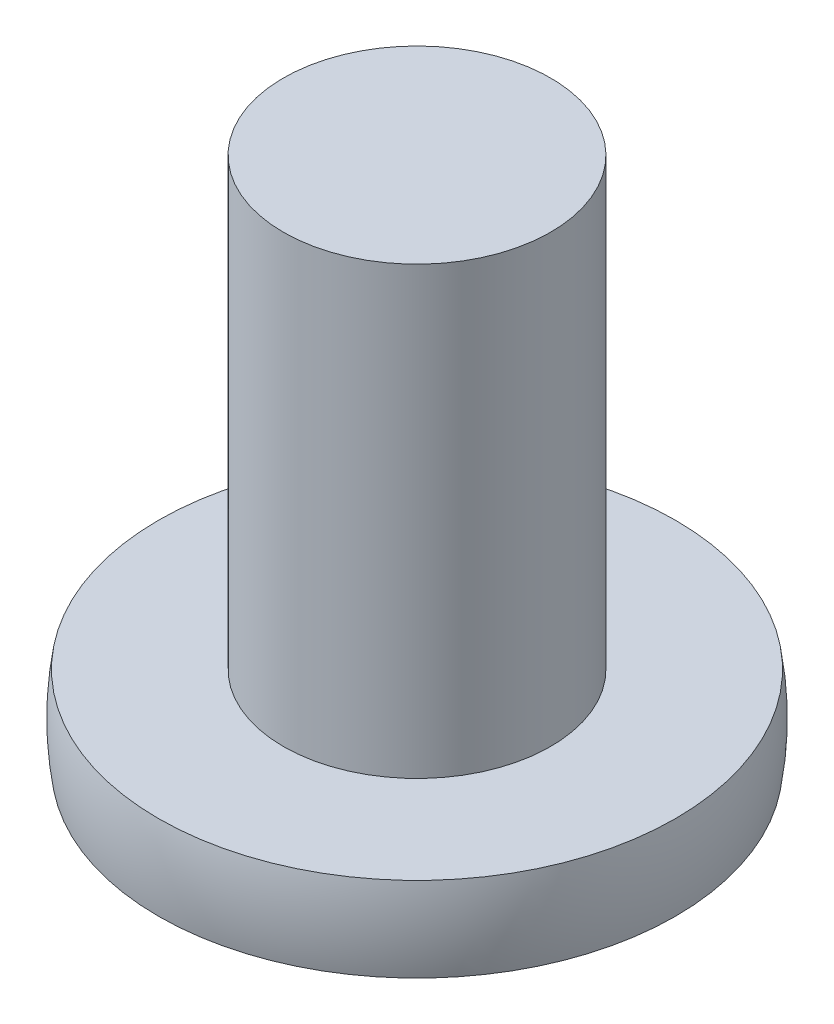
ISO-10303-21;
HEADER;
FILE_DESCRIPTION(('STEP AP214'),'2;1');
FILE_NAME('part.step','',(''),(''),'','','');
FILE_SCHEMA(('AUTOMOTIVE_DESIGN { 1 0 10303 214 1 1 1 1 }'));
ENDSEC;
DATA;
#1=APPLICATION_CONTEXT('core data for automotive mechanical design processes');
#2=APPLICATION_PROTOCOL_DEFINITION('international standard','automotive_design',2000,#1);
#3=PRODUCT_CONTEXT('',#1,'mechanical');
#4=PRODUCT('Part','Part','',(#3));
#5=PRODUCT_RELATED_PRODUCT_CATEGORY('part','',(#4));
#6=PRODUCT_DEFINITION_FORMATION('','',#4);
#7=PRODUCT_DEFINITION_CONTEXT('part definition',#1,'design');
#8=PRODUCT_DEFINITION('design','',#6,#7);
#9=PRODUCT_DEFINITION_SHAPE('','',#8);
#10=(LENGTH_UNIT() NAMED_UNIT(*) SI_UNIT(.MILLI.,.METRE.));
#11=(NAMED_UNIT(*) PLANE_ANGLE_UNIT() SI_UNIT($,.RADIAN.));
#12=(NAMED_UNIT(*) SI_UNIT($,.STERADIAN.) SOLID_ANGLE_UNIT());
#13=UNCERTAINTY_MEASURE_WITH_UNIT(LENGTH_MEASURE(1.E-05),#10,'distance_accuracy_value','');
#14=(GEOMETRIC_REPRESENTATION_CONTEXT(3) GLOBAL_UNCERTAINTY_ASSIGNED_CONTEXT((#13)) GLOBAL_UNIT_ASSIGNED_CONTEXT((#10,
#11,#12)) REPRESENTATION_CONTEXT('',''));
#15=CARTESIAN_POINT('',(0.,0.,0.));
#16=DIRECTION('',(0.,0.,1.));
#17=DIRECTION('',(1.,0.,0.));
#18=AXIS2_PLACEMENT_3D('',#15,#16,#17);
#19=CARTESIAN_POINT('',(-0.588897274573418,0.05,1.02));
#20=DIRECTION('',(-0.866025403784438,0.,0.5));
#21=DIRECTION('',(0.5,0.,0.866025403784439));
#22=AXIS2_PLACEMENT_3D('',#19,#20,#21);
#23=PLANE('',#22);
#24=DIRECTION('',(-0.5,0.,-0.866025403784439));
#25=VECTOR('',#24,1.);
#26=CARTESIAN_POINT('',(-0.588897274573418,0.,1.02));
#27=LINE('',#26,#25);
#28=CARTESIAN_POINT('',(-0.588897274573418,0.,1.02));
#29=VERTEX_POINT('',#28);
#30=CARTESIAN_POINT('',(-1.17779454914684,0.,0.));
#31=VERTEX_POINT('',#30);
#32=EDGE_CURVE('E47',#29,#31,#27,.T.);
#33=ORIENTED_EDGE('',*,*,#32,.F.);
#34=DIRECTION('',(0.,-1.,0.));
#35=VECTOR('',#34,1.);
#36=CARTESIAN_POINT('',(-0.588897274573418,0.05,1.02));
#37=LINE('',#36,#35);
#38=CARTESIAN_POINT('',(-0.588897274573418,-0.95,1.02));
#39=VERTEX_POINT('',#38);
#40=EDGE_CURVE('E127',#29,#39,#37,.T.);
#41=ORIENTED_EDGE('',*,*,#40,.T.);
#42=DIRECTION('',(-0.5,0.,-0.866025403784439));
#43=VECTOR('',#42,1.);
#44=CARTESIAN_POINT('',(-0.588897274573418,-0.95,1.02));
#45=LINE('',#44,#43);
#46=CARTESIAN_POINT('',(-1.17779454914684,-0.95,0.));
#47=VERTEX_POINT('',#46);
#48=EDGE_CURVE('E107',#39,#47,#45,.T.);
#49=ORIENTED_EDGE('',*,*,#48,.T.);
#50=DIRECTION('',(0.,-1.,0.));
#51=VECTOR('',#50,1.);
#52=CARTESIAN_POINT('',(-1.17779454914684,0.05,0.));
#53=LINE('',#52,#51);
#54=EDGE_CURVE('E94',#31,#47,#53,.T.);
#55=ORIENTED_EDGE('',*,*,#54,.F.);
#56=EDGE_LOOP('',(#33,#41,#49,#55));
#57=FACE_BOUND('',#56,.T.);
#58=ADVANCED_FACE('F32',(#57),#23,.F.);
#59=CARTESIAN_POINT('',(0.588897274573419,0.05,1.02));
#60=DIRECTION('',(0.,0.,1.));
#61=DIRECTION('',(1.,0.,0.));
#62=AXIS2_PLACEMENT_3D('',#59,#60,#61);
#63=PLANE('',#62);
#64=DIRECTION('',(-1.,0.,0.));
#65=VECTOR('',#64,1.);
#66=CARTESIAN_POINT('',(0.588897274573419,0.,1.02));
#67=LINE('',#66,#65);
#68=CARTESIAN_POINT('',(0.588897274573419,0.,1.02));
#69=VERTEX_POINT('',#68);
#70=EDGE_CURVE('E54',#69,#29,#67,.T.);
#71=ORIENTED_EDGE('',*,*,#70,.F.);
#72=DIRECTION('',(0.,-1.,0.));
#73=VECTOR('',#72,1.);
#74=CARTESIAN_POINT('',(0.588897274573419,0.05,1.02));
#75=LINE('',#74,#73);
#76=CARTESIAN_POINT('',(0.588897274573419,-0.95,1.02));
#77=VERTEX_POINT('',#76);
#78=EDGE_CURVE('E130',#69,#77,#75,.T.);
#79=ORIENTED_EDGE('',*,*,#78,.T.);
#80=DIRECTION('',(-1.,0.,0.));
#81=VECTOR('',#80,1.);
#82=CARTESIAN_POINT('',(0.588897274573419,-0.95,1.02));
#83=LINE('',#82,#81);
#84=EDGE_CURVE('E124',#77,#39,#83,.T.);
#85=ORIENTED_EDGE('',*,*,#84,.T.);
#86=ORIENTED_EDGE('',*,*,#40,.F.);
#87=EDGE_LOOP('',(#71,#79,#85,#86));
#88=FACE_BOUND('',#87,.T.);
#89=ADVANCED_FACE('F158',(#88),#63,.F.);
#90=CARTESIAN_POINT('',(1.17779454914684,0.05,0.));
#91=DIRECTION('',(0.866025403784439,0.,0.5));
#92=DIRECTION('',(0.5,0.,-0.866025403784439));
#93=AXIS2_PLACEMENT_3D('',#90,#91,#92);
#94=PLANE('',#93);
#95=DIRECTION('',(-0.5,0.,0.866025403784439));
#96=VECTOR('',#95,1.);
#97=CARTESIAN_POINT('',(1.17779454914684,0.,0.));
#98=LINE('',#97,#96);
#99=CARTESIAN_POINT('',(1.17779454914684,0.,0.));
#100=VERTEX_POINT('',#99);
#101=EDGE_CURVE('E111',#100,#69,#98,.T.);
#102=ORIENTED_EDGE('',*,*,#101,.F.);
#103=DIRECTION('',(0.,-1.,0.));
#104=VECTOR('',#103,1.);
#105=CARTESIAN_POINT('',(1.17779454914684,0.05,0.));
#106=LINE('',#105,#104);
#107=CARTESIAN_POINT('',(1.17779454914684,-0.95,0.));
#108=VERTEX_POINT('',#107);
#109=EDGE_CURVE('E132',#100,#108,#106,.T.);
#110=ORIENTED_EDGE('',*,*,#109,.T.);
#111=DIRECTION('',(-0.5,0.,0.866025403784439));
#112=VECTOR('',#111,1.);
#113=CARTESIAN_POINT('',(1.17779454914684,-0.95,0.));
#114=LINE('',#113,#112);
#115=EDGE_CURVE('E121',#108,#77,#114,.T.);
#116=ORIENTED_EDGE('',*,*,#115,.T.);
#117=ORIENTED_EDGE('',*,*,#78,.F.);
#118=EDGE_LOOP('',(#102,#110,#116,#117));
#119=FACE_BOUND('',#118,.T.);
#120=ADVANCED_FACE('F163',(#119),#94,.F.);
#121=CARTESIAN_POINT('',(0.588897274573418,0.05,-1.02));
#122=DIRECTION('',(0.866025403784439,0.,-0.5));
#123=DIRECTION('',(-0.5,0.,-0.866025403784439));
#124=AXIS2_PLACEMENT_3D('',#121,#122,#123);
#125=PLANE('',#124);
#126=DIRECTION('',(0.5,0.,0.866025403784439));
#127=VECTOR('',#126,1.);
#128=CARTESIAN_POINT('',(0.588897274573418,0.,-1.02));
#129=LINE('',#128,#127);
#130=CARTESIAN_POINT('',(0.588897274573418,0.,-1.02));
#131=VERTEX_POINT('',#130);
#132=EDGE_CURVE('E102',#131,#100,#129,.T.);
#133=ORIENTED_EDGE('',*,*,#132,.F.);
#134=DIRECTION('',(0.,-1.,0.));
#135=VECTOR('',#134,1.);
#136=CARTESIAN_POINT('',(0.588897274573418,0.05,-1.02));
#137=LINE('',#136,#135);
#138=CARTESIAN_POINT('',(0.588897274573418,-0.95,-1.02));
#139=VERTEX_POINT('',#138);
#140=EDGE_CURVE('E93',#131,#139,#137,.T.);
#141=ORIENTED_EDGE('',*,*,#140,.T.);
#142=DIRECTION('',(0.5,0.,0.866025403784439));
#143=VECTOR('',#142,1.);
#144=CARTESIAN_POINT('',(0.588897274573418,-0.95,-1.02));
#145=LINE('',#144,#143);
#146=EDGE_CURVE('E118',#139,#108,#145,.T.);
#147=ORIENTED_EDGE('',*,*,#146,.T.);
#148=ORIENTED_EDGE('',*,*,#109,.F.);
#149=EDGE_LOOP('',(#133,#141,#147,#148));
#150=FACE_BOUND('',#149,.T.);
#151=ADVANCED_FACE('F183',(#150),#125,.F.);
#152=CARTESIAN_POINT('',(-0.588897274573419,0.05,-1.02));
#153=DIRECTION('',(0.,0.,-1.));
#154=DIRECTION('',(-1.,0.,0.));
#155=AXIS2_PLACEMENT_3D('',#152,#153,#154);
#156=PLANE('',#155);
#157=DIRECTION('',(1.,0.,0.));
#158=VECTOR('',#157,1.);
#159=CARTESIAN_POINT('',(-0.588897274573419,0.,-1.02));
#160=LINE('',#159,#158);
#161=CARTESIAN_POINT('',(-0.588897274573419,0.,-1.02));
#162=VERTEX_POINT('',#161);
#163=EDGE_CURVE('E98',#162,#131,#160,.T.);
#164=ORIENTED_EDGE('',*,*,#163,.F.);
#165=DIRECTION('',(0.,-1.,0.));
#166=VECTOR('',#165,1.);
#167=CARTESIAN_POINT('',(-0.588897274573419,0.05,-1.02));
#168=LINE('',#167,#166);
#169=CARTESIAN_POINT('',(-0.588897274573419,-0.95,-1.02));
#170=VERTEX_POINT('',#169);
#171=EDGE_CURVE('E85',#162,#170,#168,.T.);
#172=ORIENTED_EDGE('',*,*,#171,.T.);
#173=DIRECTION('',(1.,0.,0.));
#174=VECTOR('',#173,1.);
#175=CARTESIAN_POINT('',(-0.588897274573419,-0.95,-1.02));
#176=LINE('',#175,#174);
#177=EDGE_CURVE('E116',#170,#139,#176,.T.);
#178=ORIENTED_EDGE('',*,*,#177,.T.);
#179=ORIENTED_EDGE('',*,*,#140,.F.);
#180=EDGE_LOOP('',(#164,#172,#178,#179));
#181=FACE_BOUND('',#180,.T.);
#182=ADVANCED_FACE('F99',(#181),#156,.F.);
#183=CARTESIAN_POINT('',(-1.17779454914684,0.05,0.));
#184=DIRECTION('',(-0.866025403784439,0.,-0.5));
#185=DIRECTION('',(-0.5,0.,0.866025403784439));
#186=AXIS2_PLACEMENT_3D('',#183,#184,#185);
#187=PLANE('',#186);
#188=DIRECTION('',(0.5,0.,-0.866025403784439));
#189=VECTOR('',#188,1.);
#190=CARTESIAN_POINT('',(-1.17779454914684,0.,0.));
#191=LINE('',#190,#189);
#192=EDGE_CURVE('E11',#31,#162,#191,.T.);
#193=ORIENTED_EDGE('',*,*,#192,.F.);
#194=ORIENTED_EDGE('',*,*,#54,.T.);
#195=DIRECTION('',(0.5,0.,-0.866025403784439));
#196=VECTOR('',#195,1.);
#197=CARTESIAN_POINT('',(-1.17779454914684,-0.95,0.));
#198=LINE('',#197,#196);
#199=EDGE_CURVE('E89',#47,#170,#198,.T.);
#200=ORIENTED_EDGE('',*,*,#199,.T.);
#201=ORIENTED_EDGE('',*,*,#171,.F.);
#202=EDGE_LOOP('',(#193,#194,#200,#201));
#203=FACE_BOUND('',#202,.T.);
#204=ADVANCED_FACE('F87',(#203),#187,.F.);
#205=CARTESIAN_POINT('',(0.,2.,0.));
#206=DIRECTION('',(0.,-1.,0.));
#207=DIRECTION('',(0.,0.,-1.));
#208=AXIS2_PLACEMENT_3D('',#205,#206,#207);
#209=CYLINDRICAL_SURFACE('',#208,1.5);
#210=CARTESIAN_POINT('',(0.,0.,0.));
#211=DIRECTION('',(0.,1.,0.));
#212=DIRECTION('',(0.,0.,1.));
#213=AXIS2_PLACEMENT_3D('',#210,#211,#212);
#214=CIRCLE('',#213,1.5);
#215=CARTESIAN_POINT('',(0.,0.,1.5));
#216=VERTEX_POINT('',#215);
#217=EDGE_CURVE('E40',#216,#216,#214,.T.);
#218=ORIENTED_EDGE('',*,*,#217,.T.);
#219=EDGE_LOOP('',(#218));
#220=FACE_BOUND('',#219,.T.);
#221=CARTESIAN_POINT('',(0.,5.,0.));
#222=DIRECTION('',(0.,1.,0.));
#223=DIRECTION('',(0.,0.,1.));
#224=AXIS2_PLACEMENT_3D('',#221,#222,#223);
#225=CIRCLE('',#224,1.5);
#226=CARTESIAN_POINT('',(0.,5.,1.5));
#227=VERTEX_POINT('',#226);
#228=EDGE_CURVE('E103',#227,#227,#225,.T.);
#229=ORIENTED_EDGE('',*,*,#228,.F.);
#230=EDGE_LOOP('',(#229));
#231=FACE_BOUND('',#230,.T.);
#232=ADVANCED_FACE('F34',(#220,#231),#209,.T.);
#233=CARTESIAN_POINT('',(0.,0.,0.));
#234=DIRECTION('',(0.,1.,0.));
#235=DIRECTION('',(0.,0.,1.));
#236=AXIS2_PLACEMENT_3D('',#233,#234,#235);
#237=PLANE('',#236);
#238=CARTESIAN_POINT('',(0.,0.,0.));
#239=DIRECTION('',(0.,1.,0.));
#240=DIRECTION('',(0.,0.,1.));
#241=AXIS2_PLACEMENT_3D('',#238,#239,#240);
#242=CIRCLE('',#241,2.90137467418464);
#243=CARTESIAN_POINT('',(0.,0.,2.90137467418464));
#244=VERTEX_POINT('',#243);
#245=EDGE_CURVE('E138',#244,#244,#242,.T.);
#246=ORIENTED_EDGE('',*,*,#245,.T.);
#247=EDGE_LOOP('',(#246));
#248=FACE_BOUND('',#247,.T.);
#249=ORIENTED_EDGE('',*,*,#217,.F.);
#250=EDGE_LOOP('',(#249));
#251=FACE_BOUND('',#250,.T.);
#252=ADVANCED_FACE('F145',(#248,#251),#237,.T.);
#253=CARTESIAN_POINT('',(0.,-0.475,0.));
#254=DIRECTION('',(0.,1.,0.));
#255=DIRECTION('',(0.,0.,1.));
#256=AXIS2_PLACEMENT_3D('',#253,#254,#255);
#257=SPHERICAL_SURFACE('',#256,2.94);
#258=CARTESIAN_POINT('',(0.,-0.95,0.));
#259=DIRECTION('',(0.,1.,0.));
#260=DIRECTION('',(0.,0.,1.));
#261=AXIS2_PLACEMENT_3D('',#258,#259,#260);
#262=CIRCLE('',#261,2.90137467418464);
#263=CARTESIAN_POINT('',(0.,-0.95,2.90137467418464));
#264=VERTEX_POINT('',#263);
#265=EDGE_CURVE('E129',#264,#264,#262,.T.);
#266=CARTESIAN_POINT('',(0.,0.,2.90137467418464));
#267=CARTESIAN_POINT('',(0.,-0.00980881629928072,2.90298053131762));
#268=CARTESIAN_POINT('',(0.,-0.0196257766451737,2.90453664313114));
#269=CARTESIAN_POINT('',(0.,-0.0392749743767388,2.90754922413465));
#270=CARTESIAN_POINT('',(0.,-0.0491072117624109,2.90900569332463));
#271=CARTESIAN_POINT('',(0.,-0.0687859525200891,2.91181883709648));
#272=CARTESIAN_POINT('',(0.,-0.078632455892095,2.91317551167835));
#273=CARTESIAN_POINT('',(0.,-0.0983387156804639,2.91578892726105));
#274=CARTESIAN_POINT('',(0.,-0.108198472096827,2.91704566826189));
#275=CARTESIAN_POINT('',(0.,-0.127930223781495,2.91945908725332));
#276=CARTESIAN_POINT('',(0.,-0.137802219049799,2.92061576524392));
#277=CARTESIAN_POINT('',(0.,-0.157557432956763,2.92282893927576));
#278=CARTESIAN_POINT('',(0.,-0.167440651595423,2.923885435317));
#279=CARTESIAN_POINT('',(0.,-0.187217295615127,2.9258981367633));
#280=CARTESIAN_POINT('',(0.,-0.197110720996172,2.92685434216836));
#281=CARTESIAN_POINT('',(0.,-0.216906760820597,2.92866636398596));
#282=CARTESIAN_POINT('',(0.,-0.226809375263978,2.9295221803985));
#283=CARTESIAN_POINT('',(0.,-0.246622774588383,2.93113333619737));
#284=CARTESIAN_POINT('',(0.,-0.256533559469406,2.9318886755837));
#285=CARTESIAN_POINT('',(0.,-0.276362280203802,2.93329879963294));
#286=CARTESIAN_POINT('',(0.,-0.286280216057174,2.93395358429586));
#287=CARTESIAN_POINT('',(0.,-0.306122218535434,2.93516253154431));
#288=CARTESIAN_POINT('',(0.,-0.316046285160321,2.93571669412984));
#289=CARTESIAN_POINT('',(0.,-0.335899528350132,2.93672434022002));
#290=CARTESIAN_POINT('',(0.,-0.345828704915055,2.93717782372468));
#291=CARTESIAN_POINT('',(0.,-0.365691146627828,2.93798406500587));
#292=CARTESIAN_POINT('',(0.,-0.375624411775678,2.93833682278241));
#293=CARTESIAN_POINT('',(0.,-0.395494008876629,2.93894157632122));
#294=CARTESIAN_POINT('',(0.,-0.40543034082973,2.93919357208349));
#295=CARTESIAN_POINT('',(0.,-0.425305049448039,2.9395967756724));
#296=CARTESIAN_POINT('',(0.,-0.435243426113248,2.93974798349905));
#297=CARTESIAN_POINT('',(0.,-0.455121201852305,2.93994959566285));
#298=CARTESIAN_POINT('',(0.,-0.465060600926153,2.94));
#299=CARTESIAN_POINT('',(0.,-0.484939399073848,2.94));
#300=CARTESIAN_POINT('',(0.,-0.494878798147696,2.93994959566285));
#301=CARTESIAN_POINT('',(0.,-0.514756573886752,2.93974798349905));
#302=CARTESIAN_POINT('',(0.,-0.524694950551961,2.9395967756724));
#303=CARTESIAN_POINT('',(0.,-0.544569659170271,2.93919357208349));
#304=CARTESIAN_POINT('',(0.,-0.554505991123371,2.93894157632122));
#305=CARTESIAN_POINT('',(0.,-0.574375588224322,2.93833682278241));
#306=CARTESIAN_POINT('',(0.,-0.584308853372173,2.93798406500587));
#307=CARTESIAN_POINT('',(0.,-0.604171295084946,2.93717782372468));
#308=CARTESIAN_POINT('',(0.,-0.614100471649869,2.93672434022002));
#309=CARTESIAN_POINT('',(0.,-0.633953714839679,2.93571669412984));
#310=CARTESIAN_POINT('',(0.,-0.643877781464567,2.93516253154431));
#311=CARTESIAN_POINT('',(0.,-0.663719783942826,2.93395358429586));
#312=CARTESIAN_POINT('',(0.,-0.673637719796198,2.93329879963294));
#313=CARTESIAN_POINT('',(0.,-0.693466440530594,2.9318886755837));
#314=CARTESIAN_POINT('',(0.,-0.703377225411618,2.93113333619737));
#315=CARTESIAN_POINT('',(0.,-0.723190624736022,2.9295221803985));
#316=CARTESIAN_POINT('',(0.,-0.733093239179403,2.92866636398596));
#317=CARTESIAN_POINT('',(0.,-0.752889279003829,2.92685434216836));
#318=CARTESIAN_POINT('',(0.,-0.762782704384873,2.9258981367633));
#319=CARTESIAN_POINT('',(0.,-0.782559348404578,2.923885435317));
#320=CARTESIAN_POINT('',(0.,-0.792442567043237,2.92282893927576));
#321=CARTESIAN_POINT('',(0.,-0.812197780950201,2.92061576524392));
#322=CARTESIAN_POINT('',(0.,-0.822069776218506,2.91945908725332));
#323=CARTESIAN_POINT('',(0.,-0.841801527903174,2.91704566826189));
#324=CARTESIAN_POINT('',(0.,-0.851661284319537,2.91578892726105));
#325=CARTESIAN_POINT('',(0.,-0.871367544107906,2.91317551167835));
#326=CARTESIAN_POINT('',(0.,-0.881214047479911,2.91181883709648));
#327=CARTESIAN_POINT('',(0.,-0.900892788237589,2.90900569332463));
#328=CARTESIAN_POINT('',(0.,-0.910725025623262,2.90754922413465));
#329=CARTESIAN_POINT('',(0.,-0.930374223354827,2.90453664313114));
#330=CARTESIAN_POINT('',(0.,-0.94019118370072,2.90298053131762));
#331=CARTESIAN_POINT('',(0.,-0.95,2.90137467418464));
#332=B_SPLINE_CURVE_WITH_KNOTS('',3,(#266,#267,#268,#269,#270,#271,#272,#273,#274,#275,#276,
#277,#278,#279,#280,#281,#282,#283,#284,#285,#286,#287,#288,#289,#290,#291,#292,#293,#294,#295,
#296,#297,#298,#299,#300,#301,#302,#303,#304,#305,#306,#307,#308,#309,#310,#311,#312,#313,#314,
#315,#316,#317,#318,#319,#320,#321,#322,#323,#324,#325,#326,#327,#328,#329,#330,#331),
.UNSPECIFIED.,.F.,.F.,(4,2,2,2,2,2,2,2,2,2,2,2,2,2,2,2,2,2,2,2,2,2,2,2,2,2,2,2,2,2,2,2,4),(0.,
0.029818069421285,0.05963613884257,0.0894542082638548,0.11927227768514,0.149090347106425,
0.17890841652771,0.208726485948995,0.23854455537028,0.268362624791564,0.298180694212849,
0.327998763634134,0.357816833055419,0.387634902476704,0.417452971897989,0.447271041319274,
0.477089110740559,0.506907180161844,0.536725249583129,0.566543319004414,0.596361388425699,
0.626179457846984,0.655997527268269,0.685815596689554,0.715633666110839,0.745451735532124,
0.775269804953408,0.805087874374693,0.834905943795978,0.864724013217263,0.894542082638548,
0.924360152059833,0.954178221481118),.UNSPECIFIED.);
#333=EDGE_CURVE('BSEAM147',#244,#264,#332,.T.);
#334=ORIENTED_EDGE('',*,*,#245,.F.);
#335=ORIENTED_EDGE('',*,*,#265,.T.);
#336=ORIENTED_EDGE('',*,*,#333,.T.);
#337=ORIENTED_EDGE('',*,*,#333,.F.);
#338=EDGE_LOOP('',(#334,#336,#335,#337));
#339=FACE_BOUND('',#338,.T.);
#340=ADVANCED_FACE('F147',(#339),#257,.T.);
#341=CARTESIAN_POINT('',(0.,-0.95,0.));
#342=DIRECTION('',(0.,1.,0.));
#343=DIRECTION('',(0.,0.,1.));
#344=AXIS2_PLACEMENT_3D('',#341,#342,#343);
#345=PLANE('',#344);
#346=ORIENTED_EDGE('',*,*,#199,.F.);
#347=ORIENTED_EDGE('',*,*,#48,.F.);
#348=ORIENTED_EDGE('',*,*,#84,.F.);
#349=ORIENTED_EDGE('',*,*,#115,.F.);
#350=ORIENTED_EDGE('',*,*,#146,.F.);
#351=ORIENTED_EDGE('',*,*,#177,.F.);
#352=EDGE_LOOP('',(#346,#347,#348,#349,#350,#351));
#353=FACE_BOUND('',#352,.T.);
#354=ORIENTED_EDGE('',*,*,#265,.F.);
#355=EDGE_LOOP('',(#354));
#356=FACE_BOUND('',#355,.T.);
#357=ADVANCED_FACE('F153',(#353,#356),#345,.F.);
#358=CARTESIAN_POINT('',(0.,0.,0.));
#359=DIRECTION('',(0.,1.,0.));
#360=DIRECTION('',(0.,0.,1.));
#361=AXIS2_PLACEMENT_3D('',#358,#359,#360);
#362=PLANE('',#361);
#363=ORIENTED_EDGE('',*,*,#70,.T.);
#364=ORIENTED_EDGE('',*,*,#32,.T.);
#365=ORIENTED_EDGE('',*,*,#192,.T.);
#366=ORIENTED_EDGE('',*,*,#163,.T.);
#367=ORIENTED_EDGE('',*,*,#132,.T.);
#368=ORIENTED_EDGE('',*,*,#101,.T.);
#369=EDGE_LOOP('',(#363,#364,#365,#366,#367,#368));
#370=FACE_BOUND('',#369,.T.);
#371=ADVANCED_FACE('F105',(#370),#362,.F.);
#372=CARTESIAN_POINT('',(0.,5.,0.));
#373=DIRECTION('',(0.,1.,0.));
#374=DIRECTION('',(0.,0.,1.));
#375=AXIS2_PLACEMENT_3D('',#372,#373,#374);
#376=PLANE('',#375);
#377=ORIENTED_EDGE('',*,*,#228,.T.);
#378=EDGE_LOOP('',(#377));
#379=FACE_BOUND('',#378,.T.);
#380=ADVANCED_FACE('F172',(#379),#376,.T.);
#381=CLOSED_SHELL('',(#58,#89,#120,#151,#182,#204,#232,#252,#340,#357,#371,#380));
#382=MANIFOLD_SOLID_BREP('B2',#381);
#383=ADVANCED_BREP_SHAPE_REPRESENTATION('',(#18,#382),#14);
#384=SHAPE_DEFINITION_REPRESENTATION(#9,#383);
ENDSEC;
END-ISO-10303-21;
